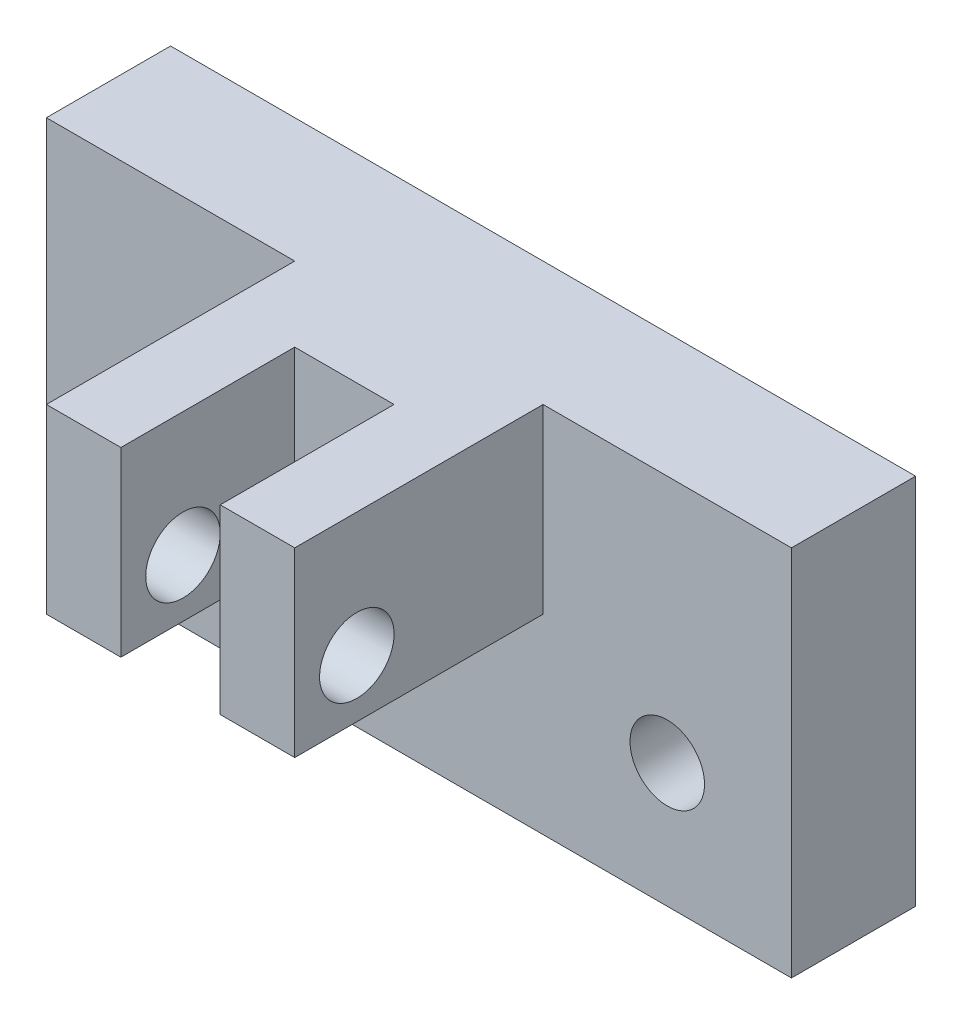
ISO-10303-21;
HEADER;
FILE_DESCRIPTION(('STEP AP214'),'2;1');
FILE_NAME('part.step','',(''),(''),'','','');
FILE_SCHEMA(('AUTOMOTIVE_DESIGN { 1 0 10303 214 1 1 1 1 }'));
ENDSEC;
DATA;
#1=APPLICATION_CONTEXT('core data for automotive mechanical design processes');
#2=APPLICATION_PROTOCOL_DEFINITION('international standard','automotive_design',2000,#1);
#3=PRODUCT_CONTEXT('',#1,'mechanical');
#4=PRODUCT('Part','Part','',(#3));
#5=PRODUCT_RELATED_PRODUCT_CATEGORY('part','',(#4));
#6=PRODUCT_DEFINITION_FORMATION('','',#4);
#7=PRODUCT_DEFINITION_CONTEXT('part definition',#1,'design');
#8=PRODUCT_DEFINITION('design','',#6,#7);
#9=PRODUCT_DEFINITION_SHAPE('','',#8);
#10=(LENGTH_UNIT() NAMED_UNIT(*) SI_UNIT(.MILLI.,.METRE.));
#11=(NAMED_UNIT(*) PLANE_ANGLE_UNIT() SI_UNIT($,.RADIAN.));
#12=(NAMED_UNIT(*) SI_UNIT($,.STERADIAN.) SOLID_ANGLE_UNIT());
#13=UNCERTAINTY_MEASURE_WITH_UNIT(LENGTH_MEASURE(1.E-05),#10,'distance_accuracy_value','');
#14=(GEOMETRIC_REPRESENTATION_CONTEXT(3) GLOBAL_UNCERTAINTY_ASSIGNED_CONTEXT((#13)) GLOBAL_UNIT_ASSIGNED_CONTEXT((#10,
#11,#12)) REPRESENTATION_CONTEXT('',''));
#15=CARTESIAN_POINT('',(0.,0.,0.));
#16=DIRECTION('',(0.,0.,1.));
#17=DIRECTION('',(1.,0.,0.));
#18=AXIS2_PLACEMENT_3D('',#15,#16,#17);
#19=CARTESIAN_POINT('',(0.,0.,15.));
#20=DIRECTION('',(0.,0.,1.));
#21=DIRECTION('',(1.,0.,0.));
#22=AXIS2_PLACEMENT_3D('',#19,#20,#21);
#23=PLANE('',#22);
#24=DIRECTION('',(0.,-1.,0.));
#25=VECTOR('',#24,1.);
#26=CARTESIAN_POINT('',(13.,15.,15.));
#27=LINE('',#26,#25);
#28=CARTESIAN_POINT('',(13.,15.,15.));
#29=VERTEX_POINT('',#28);
#30=CARTESIAN_POINT('',(13.,7.68582927556397,15.));
#31=VERTEX_POINT('',#30);
#32=EDGE_CURVE('E133',#29,#31,#27,.T.);
#33=ORIENTED_EDGE('',*,*,#32,.F.);
#34=DIRECTION('',(-1.,0.,0.));
#35=VECTOR('',#34,1.);
#36=CARTESIAN_POINT('',(10.,15.,15.));
#37=LINE('',#36,#35);
#38=CARTESIAN_POINT('',(10.,15.,15.));
#39=VERTEX_POINT('',#38);
#40=EDGE_CURVE('E182',#29,#39,#37,.T.);
#41=ORIENTED_EDGE('',*,*,#40,.T.);
#42=DIRECTION('',(0.,-1.,0.));
#43=VECTOR('',#42,1.);
#44=CARTESIAN_POINT('',(10.,15.,15.));
#45=LINE('',#44,#43);
#46=CARTESIAN_POINT('',(10.,7.68582927556397,15.));
#47=VERTEX_POINT('',#46);
#48=EDGE_CURVE('E173',#39,#47,#45,.T.);
#49=ORIENTED_EDGE('',*,*,#48,.T.);
#50=DIRECTION('',(1.,0.,0.));
#51=VECTOR('',#50,1.);
#52=CARTESIAN_POINT('',(10.,7.68582927556397,15.));
#53=LINE('',#52,#51);
#54=EDGE_CURVE('E178',#47,#31,#53,.T.);
#55=ORIENTED_EDGE('',*,*,#54,.T.);
#56=EDGE_LOOP('',(#33,#41,#49,#55));
#57=FACE_BOUND('',#56,.T.);
#58=ADVANCED_FACE('F37',(#57),#23,.T.);
#59=CARTESIAN_POINT('',(0.,0.,5.));
#60=DIRECTION('',(0.,0.,-1.));
#61=DIRECTION('',(-1.,0.,0.));
#62=AXIS2_PLACEMENT_3D('',#59,#60,#61);
#63=PLANE('',#62);
#64=CARTESIAN_POINT('',(25.,5.,5.));
#65=DIRECTION('',(0.,0.,1.));
#66=DIRECTION('',(1.,0.,0.));
#67=AXIS2_PLACEMENT_3D('',#64,#65,#66);
#68=CIRCLE('',#67,1.5);
#69=CARTESIAN_POINT('',(26.5,5.,5.));
#70=VERTEX_POINT('',#69);
#71=EDGE_CURVE('E161',#70,#70,#68,.T.);
#72=ORIENTED_EDGE('',*,*,#71,.F.);
#73=EDGE_LOOP('',(#72));
#74=FACE_BOUND('',#73,.T.);
#75=CARTESIAN_POINT('',(5.,5.,5.));
#76=DIRECTION('',(0.,0.,1.));
#77=DIRECTION('',(1.,0.,0.));
#78=AXIS2_PLACEMENT_3D('',#75,#76,#77);
#79=CIRCLE('',#78,1.5);
#80=CARTESIAN_POINT('',(6.5,5.,5.));
#81=VERTEX_POINT('',#80);
#82=EDGE_CURVE('E169',#81,#81,#79,.T.);
#83=ORIENTED_EDGE('',*,*,#82,.F.);
#84=EDGE_LOOP('',(#83));
#85=FACE_BOUND('',#84,.T.);
#86=DIRECTION('',(0.,-1.,0.));
#87=VECTOR('',#86,1.);
#88=CARTESIAN_POINT('',(10.,15.,5.));
#89=LINE('',#88,#87);
#90=CARTESIAN_POINT('',(10.,15.,5.));
#91=VERTEX_POINT('',#90);
#92=CARTESIAN_POINT('',(10.,7.68582927556397,5.));
#93=VERTEX_POINT('',#92);
#94=EDGE_CURVE('E187',#91,#93,#89,.T.);
#95=ORIENTED_EDGE('',*,*,#94,.F.);
#96=DIRECTION('',(-1.,0.,0.));
#97=VECTOR('',#96,1.);
#98=CARTESIAN_POINT('',(0.,15.,5.));
#99=LINE('',#98,#97);
#100=CARTESIAN_POINT('',(0.,15.,5.));
#101=VERTEX_POINT('',#100);
#102=EDGE_CURVE('E212',#91,#101,#99,.T.);
#103=ORIENTED_EDGE('',*,*,#102,.T.);
#104=DIRECTION('',(0.,-1.,0.));
#105=VECTOR('',#104,1.);
#106=CARTESIAN_POINT('',(0.,0.,5.));
#107=LINE('',#106,#105);
#108=CARTESIAN_POINT('',(0.,0.,5.));
#109=VERTEX_POINT('',#108);
#110=EDGE_CURVE('E204',#101,#109,#107,.T.);
#111=ORIENTED_EDGE('',*,*,#110,.T.);
#112=DIRECTION('',(1.,0.,0.));
#113=VECTOR('',#112,1.);
#114=CARTESIAN_POINT('',(0.,0.,5.));
#115=LINE('',#114,#113);
#116=CARTESIAN_POINT('',(30.,0.,5.));
#117=VERTEX_POINT('',#116);
#118=EDGE_CURVE('E207',#109,#117,#115,.T.);
#119=ORIENTED_EDGE('',*,*,#118,.T.);
#120=DIRECTION('',(0.,1.,0.));
#121=VECTOR('',#120,1.);
#122=CARTESIAN_POINT('',(30.,0.,5.));
#123=LINE('',#122,#121);
#124=CARTESIAN_POINT('',(30.,15.,5.));
#125=VERTEX_POINT('',#124);
#126=EDGE_CURVE('E210',#117,#125,#123,.T.);
#127=ORIENTED_EDGE('',*,*,#126,.T.);
#128=CARTESIAN_POINT('',(20.,15.,5.));
#129=VERTEX_POINT('',#128);
#130=EDGE_CURVE('E213',#125,#129,#99,.T.);
#131=ORIENTED_EDGE('',*,*,#130,.T.);
#132=DIRECTION('',(0.,1.,0.));
#133=VECTOR('',#132,1.);
#134=CARTESIAN_POINT('',(20.,15.,5.));
#135=LINE('',#134,#133);
#136=CARTESIAN_POINT('',(20.,7.68582927556397,5.));
#137=VERTEX_POINT('',#136);
#138=EDGE_CURVE('E177',#137,#129,#135,.T.);
#139=ORIENTED_EDGE('',*,*,#138,.F.);
#140=DIRECTION('',(1.,0.,0.));
#141=VECTOR('',#140,1.);
#142=CARTESIAN_POINT('',(10.,7.68582927556397,5.));
#143=LINE('',#142,#141);
#144=EDGE_CURVE('E62',#93,#137,#143,.T.);
#145=ORIENTED_EDGE('',*,*,#144,.F.);
#146=EDGE_LOOP('',(#95,#103,#111,#119,#127,#131,#139,#145));
#147=FACE_BOUND('',#146,.T.);
#148=ADVANCED_FACE('F264',(#74,#85,#147),#63,.F.);
#149=CARTESIAN_POINT('',(0.,0.,5.));
#150=DIRECTION('',(1.,0.,0.));
#151=DIRECTION('',(0.,0.,-1.));
#152=AXIS2_PLACEMENT_3D('',#149,#150,#151);
#153=PLANE('',#152);
#154=DIRECTION('',(0.,-1.,0.));
#155=VECTOR('',#154,1.);
#156=CARTESIAN_POINT('',(0.,0.,0.));
#157=LINE('',#156,#155);
#158=CARTESIAN_POINT('',(0.,15.,0.));
#159=VERTEX_POINT('',#158);
#160=CARTESIAN_POINT('',(0.,0.,0.));
#161=VERTEX_POINT('',#160);
#162=EDGE_CURVE('E203',#159,#161,#157,.T.);
#163=ORIENTED_EDGE('',*,*,#162,.T.);
#164=DIRECTION('',(0.,0.,-1.));
#165=VECTOR('',#164,1.);
#166=CARTESIAN_POINT('',(0.,0.,5.));
#167=LINE('',#166,#165);
#168=EDGE_CURVE('E11',#109,#161,#167,.T.);
#169=ORIENTED_EDGE('',*,*,#168,.F.);
#170=ORIENTED_EDGE('',*,*,#110,.F.);
#171=DIRECTION('',(0.,0.,-1.));
#172=VECTOR('',#171,1.);
#173=CARTESIAN_POINT('',(0.,15.,5.));
#174=LINE('',#173,#172);
#175=EDGE_CURVE('E215',#101,#159,#174,.T.);
#176=ORIENTED_EDGE('',*,*,#175,.T.);
#177=EDGE_LOOP('',(#163,#169,#170,#176));
#178=FACE_BOUND('',#177,.T.);
#179=ADVANCED_FACE('F39',(#178),#153,.F.);
#180=CARTESIAN_POINT('',(0.,0.,5.));
#181=DIRECTION('',(0.,1.,0.));
#182=DIRECTION('',(0.,0.,1.));
#183=AXIS2_PLACEMENT_3D('',#180,#181,#182);
#184=PLANE('',#183);
#185=DIRECTION('',(1.,0.,0.));
#186=VECTOR('',#185,1.);
#187=CARTESIAN_POINT('',(0.,0.,0.));
#188=LINE('',#187,#186);
#189=CARTESIAN_POINT('',(30.,0.,0.));
#190=VERTEX_POINT('',#189);
#191=EDGE_CURVE('E218',#161,#190,#188,.T.);
#192=ORIENTED_EDGE('',*,*,#191,.T.);
#193=DIRECTION('',(0.,0.,-1.));
#194=VECTOR('',#193,1.);
#195=CARTESIAN_POINT('',(30.,0.,5.));
#196=LINE('',#195,#194);
#197=EDGE_CURVE('E46',#117,#190,#196,.T.);
#198=ORIENTED_EDGE('',*,*,#197,.F.);
#199=ORIENTED_EDGE('',*,*,#118,.F.);
#200=ORIENTED_EDGE('',*,*,#168,.T.);
#201=EDGE_LOOP('',(#192,#198,#199,#200));
#202=FACE_BOUND('',#201,.T.);
#203=ADVANCED_FACE('F263',(#202),#184,.F.);
#204=CARTESIAN_POINT('',(30.,0.,5.));
#205=DIRECTION('',(-1.,0.,0.));
#206=DIRECTION('',(0.,0.,1.));
#207=AXIS2_PLACEMENT_3D('',#204,#205,#206);
#208=PLANE('',#207);
#209=DIRECTION('',(0.,1.,0.));
#210=VECTOR('',#209,1.);
#211=CARTESIAN_POINT('',(30.,0.,0.));
#212=LINE('',#211,#210);
#213=CARTESIAN_POINT('',(30.,15.,0.));
#214=VERTEX_POINT('',#213);
#215=EDGE_CURVE('E220',#190,#214,#212,.T.);
#216=ORIENTED_EDGE('',*,*,#215,.T.);
#217=DIRECTION('',(0.,0.,-1.));
#218=VECTOR('',#217,1.);
#219=CARTESIAN_POINT('',(30.,15.,5.));
#220=LINE('',#219,#218);
#221=EDGE_CURVE('E225',#125,#214,#220,.T.);
#222=ORIENTED_EDGE('',*,*,#221,.F.);
#223=ORIENTED_EDGE('',*,*,#126,.F.);
#224=ORIENTED_EDGE('',*,*,#197,.T.);
#225=EDGE_LOOP('',(#216,#222,#223,#224));
#226=FACE_BOUND('',#225,.T.);
#227=ADVANCED_FACE('F260',(#226),#208,.F.);
#228=CARTESIAN_POINT('',(0.,15.,5.));
#229=DIRECTION('',(0.,-1.,0.));
#230=DIRECTION('',(0.,0.,-1.));
#231=AXIS2_PLACEMENT_3D('',#228,#229,#230);
#232=PLANE('',#231);
#233=ORIENTED_EDGE('',*,*,#40,.F.);
#234=DIRECTION('',(0.,0.,1.));
#235=VECTOR('',#234,1.);
#236=CARTESIAN_POINT('',(13.,15.,8.));
#237=LINE('',#236,#235);
#238=CARTESIAN_POINT('',(13.,15.,8.));
#239=VERTEX_POINT('',#238);
#240=EDGE_CURVE('E159',#239,#29,#237,.T.);
#241=ORIENTED_EDGE('',*,*,#240,.F.);
#242=DIRECTION('',(-1.,0.,0.));
#243=VECTOR('',#242,1.);
#244=CARTESIAN_POINT('',(13.,15.,8.));
#245=LINE('',#244,#243);
#246=CARTESIAN_POINT('',(17.,15.,8.));
#247=VERTEX_POINT('',#246);
#248=EDGE_CURVE('E137',#247,#239,#245,.T.);
#249=ORIENTED_EDGE('',*,*,#248,.F.);
#250=DIRECTION('',(0.,0.,1.));
#251=VECTOR('',#250,1.);
#252=CARTESIAN_POINT('',(17.,15.,8.));
#253=LINE('',#252,#251);
#254=CARTESIAN_POINT('',(17.,15.,15.));
#255=VERTEX_POINT('',#254);
#256=EDGE_CURVE('E162',#247,#255,#253,.T.);
#257=ORIENTED_EDGE('',*,*,#256,.T.);
#258=CARTESIAN_POINT('',(20.,15.,15.));
#259=VERTEX_POINT('',#258);
#260=EDGE_CURVE('E183',#259,#255,#37,.T.);
#261=ORIENTED_EDGE('',*,*,#260,.F.);
#262=DIRECTION('',(0.,0.,-1.));
#263=VECTOR('',#262,1.);
#264=CARTESIAN_POINT('',(20.,15.,15.));
#265=LINE('',#264,#263);
#266=EDGE_CURVE('E195',#259,#129,#265,.T.);
#267=ORIENTED_EDGE('',*,*,#266,.T.);
#268=ORIENTED_EDGE('',*,*,#130,.F.);
#269=ORIENTED_EDGE('',*,*,#221,.T.);
#270=DIRECTION('',(-1.,0.,0.));
#271=VECTOR('',#270,1.);
#272=CARTESIAN_POINT('',(0.,15.,0.));
#273=LINE('',#272,#271);
#274=EDGE_CURVE('E208',#214,#159,#273,.T.);
#275=ORIENTED_EDGE('',*,*,#274,.T.);
#276=ORIENTED_EDGE('',*,*,#175,.F.);
#277=ORIENTED_EDGE('',*,*,#102,.F.);
#278=DIRECTION('',(0.,0.,-1.));
#279=VECTOR('',#278,1.);
#280=CARTESIAN_POINT('',(10.,15.,15.));
#281=LINE('',#280,#279);
#282=EDGE_CURVE('E186',#39,#91,#281,.T.);
#283=ORIENTED_EDGE('',*,*,#282,.F.);
#284=EDGE_LOOP('',(#233,#241,#249,#257,#261,#267,#268,#269,#275,#276,#277,#283));
#285=FACE_BOUND('',#284,.T.);
#286=ADVANCED_FACE('F241',(#285),#232,.F.);
#287=CARTESIAN_POINT('',(0.,0.,0.));
#288=DIRECTION('',(0.,0.,-1.));
#289=DIRECTION('',(-1.,0.,0.));
#290=AXIS2_PLACEMENT_3D('',#287,#288,#289);
#291=PLANE('',#290);
#292=CARTESIAN_POINT('',(25.,5.,0.));
#293=DIRECTION('',(0.,0.,-1.));
#294=DIRECTION('',(-1.,0.,0.));
#295=AXIS2_PLACEMENT_3D('',#292,#293,#294);
#296=CIRCLE('',#295,1.5);
#297=CARTESIAN_POINT('',(26.5,5.,0.));
#298=VERTEX_POINT('',#297);
#299=EDGE_CURVE('E168',#298,#298,#296,.T.);
#300=ORIENTED_EDGE('',*,*,#299,.F.);
#301=EDGE_LOOP('',(#300));
#302=FACE_BOUND('',#301,.T.);
#303=CARTESIAN_POINT('',(5.,5.,0.));
#304=DIRECTION('',(0.,0.,-1.));
#305=DIRECTION('',(-1.,0.,0.));
#306=AXIS2_PLACEMENT_3D('',#303,#304,#305);
#307=CIRCLE('',#306,1.5);
#308=CARTESIAN_POINT('',(6.5,5.,0.));
#309=VERTEX_POINT('',#308);
#310=EDGE_CURVE('E172',#309,#309,#307,.T.);
#311=ORIENTED_EDGE('',*,*,#310,.F.);
#312=EDGE_LOOP('',(#311));
#313=FACE_BOUND('',#312,.T.);
#314=ORIENTED_EDGE('',*,*,#162,.F.);
#315=ORIENTED_EDGE('',*,*,#274,.F.);
#316=ORIENTED_EDGE('',*,*,#215,.F.);
#317=ORIENTED_EDGE('',*,*,#191,.F.);
#318=EDGE_LOOP('',(#314,#315,#316,#317));
#319=FACE_BOUND('',#318,.T.);
#320=ADVANCED_FACE('F237',(#302,#313,#319),#291,.T.);
#321=CARTESIAN_POINT('',(10.,15.,15.));
#322=DIRECTION('',(1.,0.,0.));
#323=DIRECTION('',(0.,1.,0.));
#324=AXIS2_PLACEMENT_3D('',#321,#322,#323);
#325=PLANE('',#324);
#326=CARTESIAN_POINT('',(10.,10.,12.5));
#327=DIRECTION('',(-1.,0.,0.));
#328=DIRECTION('',(0.,-1.,0.));
#329=AXIS2_PLACEMENT_3D('',#326,#327,#328);
#330=CIRCLE('',#329,1.5);
#331=CARTESIAN_POINT('',(10.,8.5,12.5));
#332=VERTEX_POINT('',#331);
#333=EDGE_CURVE('E415',#332,#332,#330,.T.);
#334=ORIENTED_EDGE('',*,*,#333,.F.);
#335=EDGE_LOOP('',(#334));
#336=FACE_BOUND('',#335,.T.);
#337=ORIENTED_EDGE('',*,*,#94,.T.);
#338=DIRECTION('',(0.,0.,-1.));
#339=VECTOR('',#338,1.);
#340=CARTESIAN_POINT('',(10.,7.68582927556397,15.));
#341=LINE('',#340,#339);
#342=EDGE_CURVE('E201',#47,#93,#341,.T.);
#343=ORIENTED_EDGE('',*,*,#342,.F.);
#344=ORIENTED_EDGE('',*,*,#48,.F.);
#345=ORIENTED_EDGE('',*,*,#282,.T.);
#346=EDGE_LOOP('',(#337,#343,#344,#345));
#347=FACE_BOUND('',#346,.T.);
#348=ADVANCED_FACE('F240',(#336,#347),#325,.F.);
#349=CARTESIAN_POINT('',(10.,7.68582927556397,15.));
#350=DIRECTION('',(0.,1.,0.));
#351=DIRECTION('',(0.,0.,1.));
#352=AXIS2_PLACEMENT_3D('',#349,#350,#351);
#353=PLANE('',#352);
#354=DIRECTION('',(1.,0.,0.));
#355=VECTOR('',#354,1.);
#356=CARTESIAN_POINT('',(13.,7.68582927556397,8.));
#357=LINE('',#356,#355);
#358=CARTESIAN_POINT('',(13.,7.68582927556397,8.));
#359=VERTEX_POINT('',#358);
#360=CARTESIAN_POINT('',(17.,7.68582927556397,8.));
#361=VERTEX_POINT('',#360);
#362=EDGE_CURVE('E143',#359,#361,#357,.T.);
#363=ORIENTED_EDGE('',*,*,#362,.F.);
#364=DIRECTION('',(0.,0.,1.));
#365=VECTOR('',#364,1.);
#366=CARTESIAN_POINT('',(13.,7.68582927556397,8.));
#367=LINE('',#366,#365);
#368=EDGE_CURVE('E127',#359,#31,#367,.T.);
#369=ORIENTED_EDGE('',*,*,#368,.T.);
#370=ORIENTED_EDGE('',*,*,#54,.F.);
#371=ORIENTED_EDGE('',*,*,#342,.T.);
#372=ORIENTED_EDGE('',*,*,#144,.T.);
#373=DIRECTION('',(0.,0.,-1.));
#374=VECTOR('',#373,1.);
#375=CARTESIAN_POINT('',(20.,7.68582927556397,15.));
#376=LINE('',#375,#374);
#377=CARTESIAN_POINT('',(20.,7.68582927556397,15.));
#378=VERTEX_POINT('',#377);
#379=EDGE_CURVE('E198',#378,#137,#376,.T.);
#380=ORIENTED_EDGE('',*,*,#379,.F.);
#381=CARTESIAN_POINT('',(17.,7.68582927556397,15.));
#382=VERTEX_POINT('',#381);
#383=EDGE_CURVE('E176',#382,#378,#53,.T.);
#384=ORIENTED_EDGE('',*,*,#383,.F.);
#385=DIRECTION('',(0.,0.,1.));
#386=VECTOR('',#385,1.);
#387=CARTESIAN_POINT('',(17.,7.68582927556397,8.));
#388=LINE('',#387,#386);
#389=EDGE_CURVE('E54',#361,#382,#388,.T.);
#390=ORIENTED_EDGE('',*,*,#389,.F.);
#391=EDGE_LOOP('',(#363,#369,#370,#371,#372,#380,#384,#390));
#392=FACE_BOUND('',#391,.T.);
#393=ADVANCED_FACE('F148',(#392),#353,.F.);
#394=CARTESIAN_POINT('',(20.,15.,15.));
#395=DIRECTION('',(-1.,0.,0.));
#396=DIRECTION('',(0.,0.,1.));
#397=AXIS2_PLACEMENT_3D('',#394,#395,#396);
#398=PLANE('',#397);
#399=CARTESIAN_POINT('',(20.,10.,12.5));
#400=DIRECTION('',(-1.,0.,0.));
#401=DIRECTION('',(0.,0.,1.));
#402=AXIS2_PLACEMENT_3D('',#399,#400,#401);
#403=CIRCLE('',#402,1.5);
#404=CARTESIAN_POINT('',(20.,8.5,12.5));
#405=VERTEX_POINT('',#404);
#406=EDGE_CURVE('E157',#405,#405,#403,.T.);
#407=ORIENTED_EDGE('',*,*,#406,.T.);
#408=EDGE_LOOP('',(#407));
#409=FACE_BOUND('',#408,.T.);
#410=ORIENTED_EDGE('',*,*,#138,.T.);
#411=ORIENTED_EDGE('',*,*,#266,.F.);
#412=DIRECTION('',(0.,1.,0.));
#413=VECTOR('',#412,1.);
#414=CARTESIAN_POINT('',(20.,15.,15.));
#415=LINE('',#414,#413);
#416=EDGE_CURVE('E180',#378,#259,#415,.T.);
#417=ORIENTED_EDGE('',*,*,#416,.F.);
#418=ORIENTED_EDGE('',*,*,#379,.T.);
#419=EDGE_LOOP('',(#410,#411,#417,#418));
#420=FACE_BOUND('',#419,.T.);
#421=ADVANCED_FACE('F272',(#409,#420),#398,.F.);
#422=DIRECTION('',(0.,1.,0.));
#423=VECTOR('',#422,1.);
#424=CARTESIAN_POINT('',(17.,15.,15.));
#425=LINE('',#424,#423);
#426=EDGE_CURVE('E146',#382,#255,#425,.T.);
#427=ORIENTED_EDGE('',*,*,#426,.F.);
#428=ORIENTED_EDGE('',*,*,#383,.T.);
#429=ORIENTED_EDGE('',*,*,#416,.T.);
#430=ORIENTED_EDGE('',*,*,#260,.T.);
#431=EDGE_LOOP('',(#427,#428,#429,#430));
#432=FACE_BOUND('',#431,.T.);
#433=ADVANCED_FACE('F276',(#432),#23,.T.);
#434=CARTESIAN_POINT('',(5.,5.,-1.5));
#435=DIRECTION('',(0.,0.,1.));
#436=DIRECTION('',(1.,0.,0.));
#437=AXIS2_PLACEMENT_3D('',#434,#435,#436);
#438=CYLINDRICAL_SURFACE('',#437,1.5);
#439=CARTESIAN_POINT('',(6.5,5.,0.));
#440=CARTESIAN_POINT('',(6.5,5.,0.0520833333333336));
#441=CARTESIAN_POINT('',(6.5,5.,0.104166666666667));
#442=CARTESIAN_POINT('',(6.5,5.,0.208333333333334));
#443=CARTESIAN_POINT('',(6.5,5.,0.260416666666667));
#444=CARTESIAN_POINT('',(6.5,5.,0.364583333333334));
#445=CARTESIAN_POINT('',(6.5,5.,0.416666666666667));
#446=CARTESIAN_POINT('',(6.5,5.,0.520833333333333));
#447=CARTESIAN_POINT('',(6.5,5.,0.572916666666667));
#448=CARTESIAN_POINT('',(6.5,5.,0.677083333333333));
#449=CARTESIAN_POINT('',(6.5,5.,0.729166666666667));
#450=CARTESIAN_POINT('',(6.5,5.,0.833333333333334));
#451=CARTESIAN_POINT('',(6.5,5.,0.885416666666667));
#452=CARTESIAN_POINT('',(6.5,5.,0.989583333333334));
#453=CARTESIAN_POINT('',(6.5,5.,1.04166666666667));
#454=CARTESIAN_POINT('',(6.5,5.,1.14583333333333));
#455=CARTESIAN_POINT('',(6.5,5.,1.19791666666667));
#456=CARTESIAN_POINT('',(6.5,5.,1.30208333333333));
#457=CARTESIAN_POINT('',(6.5,5.,1.35416666666667));
#458=CARTESIAN_POINT('',(6.5,5.,1.45833333333333));
#459=CARTESIAN_POINT('',(6.5,5.,1.51041666666667));
#460=CARTESIAN_POINT('',(6.5,5.,1.61458333333333));
#461=CARTESIAN_POINT('',(6.5,5.,1.66666666666667));
#462=CARTESIAN_POINT('',(6.5,5.,1.77083333333333));
#463=CARTESIAN_POINT('',(6.5,5.,1.82291666666667));
#464=CARTESIAN_POINT('',(6.5,5.,1.92708333333333));
#465=CARTESIAN_POINT('',(6.5,5.,1.97916666666667));
#466=CARTESIAN_POINT('',(6.5,5.,2.08333333333333));
#467=CARTESIAN_POINT('',(6.5,5.,2.13541666666667));
#468=CARTESIAN_POINT('',(6.5,5.,2.23958333333333));
#469=CARTESIAN_POINT('',(6.5,5.,2.29166666666667));
#470=CARTESIAN_POINT('',(6.5,5.,2.39583333333333));
#471=CARTESIAN_POINT('',(6.5,5.,2.44791666666667));
#472=CARTESIAN_POINT('',(6.5,5.,2.55208333333333));
#473=CARTESIAN_POINT('',(6.5,5.,2.60416666666667));
#474=CARTESIAN_POINT('',(6.5,5.,2.70833333333333));
#475=CARTESIAN_POINT('',(6.5,5.,2.76041666666667));
#476=CARTESIAN_POINT('',(6.5,5.,2.86458333333333));
#477=CARTESIAN_POINT('',(6.5,5.,2.91666666666667));
#478=CARTESIAN_POINT('',(6.5,5.,3.02083333333333));
#479=CARTESIAN_POINT('',(6.5,5.,3.07291666666667));
#480=CARTESIAN_POINT('',(6.5,5.,3.17708333333333));
#481=CARTESIAN_POINT('',(6.5,5.,3.22916666666667));
#482=CARTESIAN_POINT('',(6.5,5.,3.33333333333333));
#483=CARTESIAN_POINT('',(6.5,5.,3.38541666666667));
#484=CARTESIAN_POINT('',(6.5,5.,3.48958333333333));
#485=CARTESIAN_POINT('',(6.5,5.,3.54166666666667));
#486=CARTESIAN_POINT('',(6.5,5.,3.64583333333333));
#487=CARTESIAN_POINT('',(6.5,5.,3.69791666666667));
#488=CARTESIAN_POINT('',(6.5,5.,3.80208333333333));
#489=CARTESIAN_POINT('',(6.5,5.,3.85416666666667));
#490=CARTESIAN_POINT('',(6.5,5.,3.95833333333333));
#491=CARTESIAN_POINT('',(6.5,5.,4.01041666666667));
#492=CARTESIAN_POINT('',(6.5,5.,4.11458333333333));
#493=CARTESIAN_POINT('',(6.5,5.,4.16666666666667));
#494=CARTESIAN_POINT('',(6.5,5.,4.27083333333333));
#495=CARTESIAN_POINT('',(6.5,5.,4.32291666666667));
#496=CARTESIAN_POINT('',(6.5,5.,4.42708333333333));
#497=CARTESIAN_POINT('',(6.5,5.,4.47916666666667));
#498=CARTESIAN_POINT('',(6.5,5.,4.58333333333333));
#499=CARTESIAN_POINT('',(6.5,5.,4.63541666666667));
#500=CARTESIAN_POINT('',(6.5,5.,4.73958333333333));
#501=CARTESIAN_POINT('',(6.5,5.,4.79166666666667));
#502=CARTESIAN_POINT('',(6.5,5.,4.89583333333333));
#503=CARTESIAN_POINT('',(6.5,5.,4.94791666666667));
#504=CARTESIAN_POINT('',(6.5,5.,5.));
#505=B_SPLINE_CURVE_WITH_KNOTS('',3,(#439,#440,#441,#442,#443,#444,#445,#446,#447,#448,#449,
#450,#451,#452,#453,#454,#455,#456,#457,#458,#459,#460,#461,#462,#463,#464,#465,#466,#467,#468,
#469,#470,#471,#472,#473,#474,#475,#476,#477,#478,#479,#480,#481,#482,#483,#484,#485,#486,#487,
#488,#489,#490,#491,#492,#493,#494,#495,#496,#497,#498,#499,#500,#501,#502,#503,#504),
.UNSPECIFIED.,.F.,.F.,(4,2,2,2,2,2,2,2,2,2,2,2,2,2,2,2,2,2,2,2,2,2,2,2,2,2,2,2,2,2,2,2,4),(0.,
0.15625,0.3125,0.46875,0.625,0.78125,0.9375,1.09375,1.25,1.40625,1.5625,1.71875,1.875,2.03125,
2.1875,2.34375,2.5,2.65625,2.8125,2.96875,3.125,3.28125,3.4375,3.59375,3.75,3.90625,4.0625,
4.21875,4.375,4.53125,4.6875,4.84375,5.),.UNSPECIFIED.);
#506=EDGE_CURVE('BSEAM301',#309,#81,#505,.T.);
#507=ORIENTED_EDGE('',*,*,#310,.T.);
#508=ORIENTED_EDGE('',*,*,#82,.T.);
#509=ORIENTED_EDGE('',*,*,#506,.T.);
#510=ORIENTED_EDGE('',*,*,#506,.F.);
#511=EDGE_LOOP('',(#507,#509,#508,#510));
#512=FACE_BOUND('',#511,.T.);
#513=ADVANCED_FACE('F301',(#512),#438,.F.);
#514=CARTESIAN_POINT('',(25.,5.,-1.5));
#515=DIRECTION('',(0.,0.,1.));
#516=DIRECTION('',(1.,0.,0.));
#517=AXIS2_PLACEMENT_3D('',#514,#515,#516);
#518=CYLINDRICAL_SURFACE('',#517,1.5);
#519=CARTESIAN_POINT('',(26.5,5.,0.));
#520=CARTESIAN_POINT('',(26.5,5.,0.0520833333333336));
#521=CARTESIAN_POINT('',(26.5,5.,0.104166666666667));
#522=CARTESIAN_POINT('',(26.5,5.,0.208333333333334));
#523=CARTESIAN_POINT('',(26.5,5.,0.260416666666667));
#524=CARTESIAN_POINT('',(26.5,5.,0.364583333333334));
#525=CARTESIAN_POINT('',(26.5,5.,0.416666666666667));
#526=CARTESIAN_POINT('',(26.5,5.,0.520833333333333));
#527=CARTESIAN_POINT('',(26.5,5.,0.572916666666667));
#528=CARTESIAN_POINT('',(26.5,5.,0.677083333333333));
#529=CARTESIAN_POINT('',(26.5,5.,0.729166666666667));
#530=CARTESIAN_POINT('',(26.5,5.,0.833333333333334));
#531=CARTESIAN_POINT('',(26.5,5.,0.885416666666667));
#532=CARTESIAN_POINT('',(26.5,5.,0.989583333333334));
#533=CARTESIAN_POINT('',(26.5,5.,1.04166666666667));
#534=CARTESIAN_POINT('',(26.5,5.,1.14583333333333));
#535=CARTESIAN_POINT('',(26.5,5.,1.19791666666667));
#536=CARTESIAN_POINT('',(26.5,5.,1.30208333333333));
#537=CARTESIAN_POINT('',(26.5,5.,1.35416666666667));
#538=CARTESIAN_POINT('',(26.5,5.,1.45833333333333));
#539=CARTESIAN_POINT('',(26.5,5.,1.51041666666667));
#540=CARTESIAN_POINT('',(26.5,5.,1.61458333333333));
#541=CARTESIAN_POINT('',(26.5,5.,1.66666666666667));
#542=CARTESIAN_POINT('',(26.5,5.,1.77083333333333));
#543=CARTESIAN_POINT('',(26.5,5.,1.82291666666667));
#544=CARTESIAN_POINT('',(26.5,5.,1.92708333333333));
#545=CARTESIAN_POINT('',(26.5,5.,1.97916666666667));
#546=CARTESIAN_POINT('',(26.5,5.,2.08333333333333));
#547=CARTESIAN_POINT('',(26.5,5.,2.13541666666667));
#548=CARTESIAN_POINT('',(26.5,5.,2.23958333333333));
#549=CARTESIAN_POINT('',(26.5,5.,2.29166666666667));
#550=CARTESIAN_POINT('',(26.5,5.,2.39583333333333));
#551=CARTESIAN_POINT('',(26.5,5.,2.44791666666667));
#552=CARTESIAN_POINT('',(26.5,5.,2.55208333333333));
#553=CARTESIAN_POINT('',(26.5,5.,2.60416666666667));
#554=CARTESIAN_POINT('',(26.5,5.,2.70833333333333));
#555=CARTESIAN_POINT('',(26.5,5.,2.76041666666667));
#556=CARTESIAN_POINT('',(26.5,5.,2.86458333333333));
#557=CARTESIAN_POINT('',(26.5,5.,2.91666666666667));
#558=CARTESIAN_POINT('',(26.5,5.,3.02083333333333));
#559=CARTESIAN_POINT('',(26.5,5.,3.07291666666667));
#560=CARTESIAN_POINT('',(26.5,5.,3.17708333333333));
#561=CARTESIAN_POINT('',(26.5,5.,3.22916666666667));
#562=CARTESIAN_POINT('',(26.5,5.,3.33333333333333));
#563=CARTESIAN_POINT('',(26.5,5.,3.38541666666667));
#564=CARTESIAN_POINT('',(26.5,5.,3.48958333333333));
#565=CARTESIAN_POINT('',(26.5,5.,3.54166666666667));
#566=CARTESIAN_POINT('',(26.5,5.,3.64583333333333));
#567=CARTESIAN_POINT('',(26.5,5.,3.69791666666667));
#568=CARTESIAN_POINT('',(26.5,5.,3.80208333333333));
#569=CARTESIAN_POINT('',(26.5,5.,3.85416666666667));
#570=CARTESIAN_POINT('',(26.5,5.,3.95833333333333));
#571=CARTESIAN_POINT('',(26.5,5.,4.01041666666667));
#572=CARTESIAN_POINT('',(26.5,5.,4.11458333333333));
#573=CARTESIAN_POINT('',(26.5,5.,4.16666666666667));
#574=CARTESIAN_POINT('',(26.5,5.,4.27083333333333));
#575=CARTESIAN_POINT('',(26.5,5.,4.32291666666667));
#576=CARTESIAN_POINT('',(26.5,5.,4.42708333333333));
#577=CARTESIAN_POINT('',(26.5,5.,4.47916666666667));
#578=CARTESIAN_POINT('',(26.5,5.,4.58333333333333));
#579=CARTESIAN_POINT('',(26.5,5.,4.63541666666667));
#580=CARTESIAN_POINT('',(26.5,5.,4.73958333333333));
#581=CARTESIAN_POINT('',(26.5,5.,4.79166666666667));
#582=CARTESIAN_POINT('',(26.5,5.,4.89583333333333));
#583=CARTESIAN_POINT('',(26.5,5.,4.94791666666667));
#584=CARTESIAN_POINT('',(26.5,5.,5.));
#585=B_SPLINE_CURVE_WITH_KNOTS('',3,(#519,#520,#521,#522,#523,#524,#525,#526,#527,#528,#529,
#530,#531,#532,#533,#534,#535,#536,#537,#538,#539,#540,#541,#542,#543,#544,#545,#546,#547,#548,
#549,#550,#551,#552,#553,#554,#555,#556,#557,#558,#559,#560,#561,#562,#563,#564,#565,#566,#567,
#568,#569,#570,#571,#572,#573,#574,#575,#576,#577,#578,#579,#580,#581,#582,#583,#584),
.UNSPECIFIED.,.F.,.F.,(4,2,2,2,2,2,2,2,2,2,2,2,2,2,2,2,2,2,2,2,2,2,2,2,2,2,2,2,2,2,2,2,4),(0.,
0.15625,0.3125,0.46875,0.625,0.78125,0.9375,1.09375,1.25,1.40625,1.5625,1.71875,1.875,2.03125,
2.1875,2.34375,2.5,2.65625,2.8125,2.96875,3.125,3.28125,3.4375,3.59375,3.75,3.90625,4.0625,
4.21875,4.375,4.53125,4.6875,4.84375,5.),.UNSPECIFIED.);
#586=EDGE_CURVE('BSEAM234',#298,#70,#585,.T.);
#587=ORIENTED_EDGE('',*,*,#299,.T.);
#588=ORIENTED_EDGE('',*,*,#71,.T.);
#589=ORIENTED_EDGE('',*,*,#586,.T.);
#590=ORIENTED_EDGE('',*,*,#586,.F.);
#591=EDGE_LOOP('',(#587,#589,#588,#590));
#592=FACE_BOUND('',#591,.T.);
#593=ADVANCED_FACE('F234',(#592),#518,.F.);
#594=CARTESIAN_POINT('',(13.,15.,8.));
#595=DIRECTION('',(-1.,0.,0.));
#596=DIRECTION('',(0.,-1.,0.));
#597=AXIS2_PLACEMENT_3D('',#594,#595,#596);
#598=PLANE('',#597);
#599=CARTESIAN_POINT('',(13.,10.,12.5));
#600=DIRECTION('',(-1.,0.,0.));
#601=DIRECTION('',(0.,-1.,0.));
#602=AXIS2_PLACEMENT_3D('',#599,#600,#601);
#603=CIRCLE('',#602,1.5);
#604=CARTESIAN_POINT('',(13.,8.5,12.5));
#605=VERTEX_POINT('',#604);
#606=EDGE_CURVE('E418',#605,#605,#603,.T.);
#607=ORIENTED_EDGE('',*,*,#606,.T.);
#608=EDGE_LOOP('',(#607));
#609=FACE_BOUND('',#608,.T.);
#610=ORIENTED_EDGE('',*,*,#32,.T.);
#611=ORIENTED_EDGE('',*,*,#368,.F.);
#612=DIRECTION('',(0.,-1.,0.));
#613=VECTOR('',#612,1.);
#614=CARTESIAN_POINT('',(13.,15.,8.));
#615=LINE('',#614,#613);
#616=EDGE_CURVE('E130',#239,#359,#615,.T.);
#617=ORIENTED_EDGE('',*,*,#616,.F.);
#618=ORIENTED_EDGE('',*,*,#240,.T.);
#619=EDGE_LOOP('',(#610,#611,#617,#618));
#620=FACE_BOUND('',#619,.T.);
#621=ADVANCED_FACE('F129',(#609,#620),#598,.F.);
#622=CARTESIAN_POINT('',(17.,15.,8.));
#623=DIRECTION('',(1.,0.,0.));
#624=DIRECTION('',(0.,0.,-1.));
#625=AXIS2_PLACEMENT_3D('',#622,#623,#624);
#626=PLANE('',#625);
#627=CARTESIAN_POINT('',(17.,10.,12.5));
#628=DIRECTION('',(1.,0.,0.));
#629=DIRECTION('',(0.,0.,-1.));
#630=AXIS2_PLACEMENT_3D('',#627,#628,#629);
#631=CIRCLE('',#630,1.5);
#632=CARTESIAN_POINT('',(17.,8.5,12.5));
#633=VERTEX_POINT('',#632);
#634=EDGE_CURVE('E41',#633,#633,#631,.T.);
#635=ORIENTED_EDGE('',*,*,#634,.T.);
#636=EDGE_LOOP('',(#635));
#637=FACE_BOUND('',#636,.T.);
#638=ORIENTED_EDGE('',*,*,#426,.T.);
#639=ORIENTED_EDGE('',*,*,#256,.F.);
#640=DIRECTION('',(0.,1.,0.));
#641=VECTOR('',#640,1.);
#642=CARTESIAN_POINT('',(17.,15.,8.));
#643=LINE('',#642,#641);
#644=EDGE_CURVE('E150',#361,#247,#643,.T.);
#645=ORIENTED_EDGE('',*,*,#644,.F.);
#646=ORIENTED_EDGE('',*,*,#389,.T.);
#647=EDGE_LOOP('',(#638,#639,#645,#646));
#648=FACE_BOUND('',#647,.T.);
#649=ADVANCED_FACE('F277',(#637,#648),#626,.F.);
#650=CARTESIAN_POINT('',(0.,0.,8.));
#651=DIRECTION('',(0.,0.,1.));
#652=DIRECTION('',(1.,0.,0.));
#653=AXIS2_PLACEMENT_3D('',#650,#651,#652);
#654=PLANE('',#653);
#655=ORIENTED_EDGE('',*,*,#616,.T.);
#656=ORIENTED_EDGE('',*,*,#362,.T.);
#657=ORIENTED_EDGE('',*,*,#644,.T.);
#658=ORIENTED_EDGE('',*,*,#248,.T.);
#659=EDGE_LOOP('',(#655,#656,#657,#658));
#660=FACE_BOUND('',#659,.T.);
#661=ADVANCED_FACE('F141',(#660),#654,.T.);
#662=CARTESIAN_POINT('',(25.,10.,12.5));
#663=DIRECTION('',(-1.,0.,0.));
#664=DIRECTION('',(0.,-1.,0.));
#665=AXIS2_PLACEMENT_3D('',#662,#663,#664);
#666=CYLINDRICAL_SURFACE('',#665,1.5);
#667=CARTESIAN_POINT('',(17.,8.5,12.5));
#668=CARTESIAN_POINT('',(17.03125,8.5,12.5));
#669=CARTESIAN_POINT('',(17.0625,8.5,12.5));
#670=CARTESIAN_POINT('',(17.125,8.5,12.5));
#671=CARTESIAN_POINT('',(17.15625,8.5,12.5));
#672=CARTESIAN_POINT('',(17.21875,8.5,12.5));
#673=CARTESIAN_POINT('',(17.25,8.5,12.5));
#674=CARTESIAN_POINT('',(17.3125,8.5,12.5));
#675=CARTESIAN_POINT('',(17.34375,8.5,12.5));
#676=CARTESIAN_POINT('',(17.40625,8.5,12.5));
#677=CARTESIAN_POINT('',(17.4375,8.5,12.5));
#678=CARTESIAN_POINT('',(17.5,8.5,12.5));
#679=CARTESIAN_POINT('',(17.53125,8.5,12.5));
#680=CARTESIAN_POINT('',(17.59375,8.5,12.5));
#681=CARTESIAN_POINT('',(17.625,8.5,12.5));
#682=CARTESIAN_POINT('',(17.6875,8.5,12.5));
#683=CARTESIAN_POINT('',(17.71875,8.5,12.5));
#684=CARTESIAN_POINT('',(17.78125,8.5,12.5));
#685=CARTESIAN_POINT('',(17.8125,8.5,12.5));
#686=CARTESIAN_POINT('',(17.875,8.5,12.5));
#687=CARTESIAN_POINT('',(17.90625,8.5,12.5));
#688=CARTESIAN_POINT('',(17.96875,8.5,12.5));
#689=CARTESIAN_POINT('',(18.,8.5,12.5));
#690=CARTESIAN_POINT('',(18.0625,8.5,12.5));
#691=CARTESIAN_POINT('',(18.09375,8.5,12.5));
#692=CARTESIAN_POINT('',(18.15625,8.5,12.5));
#693=CARTESIAN_POINT('',(18.1875,8.5,12.5));
#694=CARTESIAN_POINT('',(18.25,8.5,12.5));
#695=CARTESIAN_POINT('',(18.28125,8.5,12.5));
#696=CARTESIAN_POINT('',(18.34375,8.5,12.5));
#697=CARTESIAN_POINT('',(18.375,8.5,12.5));
#698=CARTESIAN_POINT('',(18.4375,8.5,12.5));
#699=CARTESIAN_POINT('',(18.46875,8.5,12.5));
#700=CARTESIAN_POINT('',(18.53125,8.5,12.5));
#701=CARTESIAN_POINT('',(18.5625,8.5,12.5));
#702=CARTESIAN_POINT('',(18.625,8.5,12.5));
#703=CARTESIAN_POINT('',(18.65625,8.5,12.5));
#704=CARTESIAN_POINT('',(18.71875,8.5,12.5));
#705=CARTESIAN_POINT('',(18.75,8.5,12.5));
#706=CARTESIAN_POINT('',(18.8125,8.5,12.5));
#707=CARTESIAN_POINT('',(18.84375,8.5,12.5));
#708=CARTESIAN_POINT('',(18.90625,8.5,12.5));
#709=CARTESIAN_POINT('',(18.9375,8.5,12.5));
#710=CARTESIAN_POINT('',(19.,8.5,12.5));
#711=CARTESIAN_POINT('',(19.03125,8.5,12.5));
#712=CARTESIAN_POINT('',(19.09375,8.5,12.5));
#713=CARTESIAN_POINT('',(19.125,8.5,12.5));
#714=CARTESIAN_POINT('',(19.1875,8.5,12.5));
#715=CARTESIAN_POINT('',(19.21875,8.5,12.5));
#716=CARTESIAN_POINT('',(19.28125,8.5,12.5));
#717=CARTESIAN_POINT('',(19.3125,8.5,12.5));
#718=CARTESIAN_POINT('',(19.375,8.5,12.5));
#719=CARTESIAN_POINT('',(19.40625,8.5,12.5));
#720=CARTESIAN_POINT('',(19.46875,8.5,12.5));
#721=CARTESIAN_POINT('',(19.5,8.5,12.5));
#722=CARTESIAN_POINT('',(19.5625,8.5,12.5));
#723=CARTESIAN_POINT('',(19.59375,8.5,12.5));
#724=CARTESIAN_POINT('',(19.65625,8.5,12.5));
#725=CARTESIAN_POINT('',(19.6875,8.5,12.5));
#726=CARTESIAN_POINT('',(19.75,8.5,12.5));
#727=CARTESIAN_POINT('',(19.78125,8.5,12.5));
#728=CARTESIAN_POINT('',(19.84375,8.5,12.5));
#729=CARTESIAN_POINT('',(19.875,8.5,12.5));
#730=CARTESIAN_POINT('',(19.9375,8.5,12.5));
#731=CARTESIAN_POINT('',(19.96875,8.5,12.5));
#732=CARTESIAN_POINT('',(20.,8.5,12.5));
#733=B_SPLINE_CURVE_WITH_KNOTS('',3,(#667,#668,#669,#670,#671,#672,#673,#674,#675,#676,#677,
#678,#679,#680,#681,#682,#683,#684,#685,#686,#687,#688,#689,#690,#691,#692,#693,#694,#695,#696,
#697,#698,#699,#700,#701,#702,#703,#704,#705,#706,#707,#708,#709,#710,#711,#712,#713,#714,#715,
#716,#717,#718,#719,#720,#721,#722,#723,#724,#725,#726,#727,#728,#729,#730,#731,#732),
.UNSPECIFIED.,.F.,.F.,(4,2,2,2,2,2,2,2,2,2,2,2,2,2,2,2,2,2,2,2,2,2,2,2,2,2,2,2,2,2,2,2,4),(0.,
0.0937500000000036,0.1875,0.28125,0.375,0.46875,0.5625,0.656250000000001,0.750000000000001,
0.843750000000001,0.937500000000001,1.03125,1.125,1.21875,1.3125,1.40625,1.5,1.59375,1.6875,
1.78125000000001,1.875,1.96875000000001,2.06250000000001,2.15625000000001,2.25000000000001,
2.34375000000001,2.43750000000001,2.53125000000001,2.62500000000001,2.71875000000001,
2.81250000000001,2.90625000000001,3.00000000000001),.UNSPECIFIED.);
#734=EDGE_CURVE('BSEAM286',#633,#405,#733,.T.);
#735=ORIENTED_EDGE('',*,*,#634,.F.);
#736=ORIENTED_EDGE('',*,*,#406,.F.);
#737=ORIENTED_EDGE('',*,*,#734,.T.);
#738=ORIENTED_EDGE('',*,*,#734,.F.);
#739=EDGE_LOOP('',(#735,#737,#736,#738));
#740=FACE_BOUND('',#739,.T.);
#741=ADVANCED_FACE('F286',(#740),#666,.F.);
#742=CARTESIAN_POINT('',(10.,8.5,12.5));
#743=CARTESIAN_POINT('',(10.03125,8.5,12.5));
#744=CARTESIAN_POINT('',(10.0625,8.5,12.5));
#745=CARTESIAN_POINT('',(10.125,8.5,12.5));
#746=CARTESIAN_POINT('',(10.15625,8.5,12.5));
#747=CARTESIAN_POINT('',(10.21875,8.5,12.5));
#748=CARTESIAN_POINT('',(10.25,8.5,12.5));
#749=CARTESIAN_POINT('',(10.3125,8.5,12.5));
#750=CARTESIAN_POINT('',(10.34375,8.5,12.5));
#751=CARTESIAN_POINT('',(10.40625,8.5,12.5));
#752=CARTESIAN_POINT('',(10.4375,8.5,12.5));
#753=CARTESIAN_POINT('',(10.5,8.5,12.5));
#754=CARTESIAN_POINT('',(10.53125,8.5,12.5));
#755=CARTESIAN_POINT('',(10.59375,8.5,12.5));
#756=CARTESIAN_POINT('',(10.625,8.5,12.5));
#757=CARTESIAN_POINT('',(10.6875,8.5,12.5));
#758=CARTESIAN_POINT('',(10.71875,8.5,12.5));
#759=CARTESIAN_POINT('',(10.78125,8.5,12.5));
#760=CARTESIAN_POINT('',(10.8125,8.5,12.5));
#761=CARTESIAN_POINT('',(10.875,8.5,12.5));
#762=CARTESIAN_POINT('',(10.90625,8.5,12.5));
#763=CARTESIAN_POINT('',(10.96875,8.5,12.5));
#764=CARTESIAN_POINT('',(11.,8.5,12.5));
#765=CARTESIAN_POINT('',(11.0625,8.5,12.5));
#766=CARTESIAN_POINT('',(11.09375,8.5,12.5));
#767=CARTESIAN_POINT('',(11.15625,8.5,12.5));
#768=CARTESIAN_POINT('',(11.1875,8.5,12.5));
#769=CARTESIAN_POINT('',(11.25,8.5,12.5));
#770=CARTESIAN_POINT('',(11.28125,8.5,12.5));
#771=CARTESIAN_POINT('',(11.34375,8.5,12.5));
#772=CARTESIAN_POINT('',(11.375,8.5,12.5));
#773=CARTESIAN_POINT('',(11.4375,8.5,12.5));
#774=CARTESIAN_POINT('',(11.46875,8.5,12.5));
#775=CARTESIAN_POINT('',(11.53125,8.5,12.5));
#776=CARTESIAN_POINT('',(11.5625,8.5,12.5));
#777=CARTESIAN_POINT('',(11.625,8.5,12.5));
#778=CARTESIAN_POINT('',(11.65625,8.5,12.5));
#779=CARTESIAN_POINT('',(11.71875,8.5,12.5));
#780=CARTESIAN_POINT('',(11.75,8.5,12.5));
#781=CARTESIAN_POINT('',(11.8125,8.5,12.5));
#782=CARTESIAN_POINT('',(11.84375,8.5,12.5));
#783=CARTESIAN_POINT('',(11.90625,8.5,12.5));
#784=CARTESIAN_POINT('',(11.9375,8.5,12.5));
#785=CARTESIAN_POINT('',(12.,8.5,12.5));
#786=CARTESIAN_POINT('',(12.03125,8.5,12.5));
#787=CARTESIAN_POINT('',(12.09375,8.5,12.5));
#788=CARTESIAN_POINT('',(12.125,8.5,12.5));
#789=CARTESIAN_POINT('',(12.1875,8.5,12.5));
#790=CARTESIAN_POINT('',(12.21875,8.5,12.5));
#791=CARTESIAN_POINT('',(12.28125,8.5,12.5));
#792=CARTESIAN_POINT('',(12.3125,8.5,12.5));
#793=CARTESIAN_POINT('',(12.375,8.5,12.5));
#794=CARTESIAN_POINT('',(12.40625,8.5,12.5));
#795=CARTESIAN_POINT('',(12.46875,8.5,12.5));
#796=CARTESIAN_POINT('',(12.5,8.5,12.5));
#797=CARTESIAN_POINT('',(12.5625,8.5,12.5));
#798=CARTESIAN_POINT('',(12.59375,8.5,12.5));
#799=CARTESIAN_POINT('',(12.65625,8.5,12.5));
#800=CARTESIAN_POINT('',(12.6875,8.5,12.5));
#801=CARTESIAN_POINT('',(12.75,8.5,12.5));
#802=CARTESIAN_POINT('',(12.78125,8.5,12.5));
#803=CARTESIAN_POINT('',(12.84375,8.5,12.5));
#804=CARTESIAN_POINT('',(12.875,8.5,12.5));
#805=CARTESIAN_POINT('',(12.9375,8.5,12.5));
#806=CARTESIAN_POINT('',(12.96875,8.5,12.5));
#807=CARTESIAN_POINT('',(13.,8.5,12.5));
#808=B_SPLINE_CURVE_WITH_KNOTS('',3,(#742,#743,#744,#745,#746,#747,#748,#749,#750,#751,#752,
#753,#754,#755,#756,#757,#758,#759,#760,#761,#762,#763,#764,#765,#766,#767,#768,#769,#770,#771,
#772,#773,#774,#775,#776,#777,#778,#779,#780,#781,#782,#783,#784,#785,#786,#787,#788,#789,#790,
#791,#792,#793,#794,#795,#796,#797,#798,#799,#800,#801,#802,#803,#804,#805,#806,#807),
.UNSPECIFIED.,.F.,.F.,(4,2,2,2,2,2,2,2,2,2,2,2,2,2,2,2,2,2,2,2,2,2,2,2,2,2,2,2,2,2,2,2,4),(0.,
0.0937500000000001,0.1875,0.28125,0.375,0.46875,0.5625,0.656250000000001,0.750000000000001,
0.843749999999999,0.937499999999999,1.03125,1.125,1.21875,1.3125,1.40625,1.5,1.59375,1.6875,
1.78125,1.875,1.96875,2.0625,2.15625,2.25,2.34375,2.4375,2.53125,2.625,2.71875,2.8125,2.90625,
3.),.UNSPECIFIED.);
#809=EDGE_CURVE('BSEAM399',#332,#605,#808,.T.);
#810=ORIENTED_EDGE('',*,*,#333,.T.);
#811=ORIENTED_EDGE('',*,*,#606,.F.);
#812=ORIENTED_EDGE('',*,*,#809,.T.);
#813=ORIENTED_EDGE('',*,*,#809,.F.);
#814=EDGE_LOOP('',(#810,#812,#811,#813));
#815=FACE_BOUND('',#814,.T.);
#816=ADVANCED_FACE('F399',(#815),#666,.F.);
#817=CLOSED_SHELL('',(#58,#148,#179,#203,#227,#286,#320,#348,#393,#421,#433,#513,#593,#621,#649,
#661,#741,#816));
#818=MANIFOLD_SOLID_BREP('B2',#817);
#819=ADVANCED_BREP_SHAPE_REPRESENTATION('',(#18,#818),#14);
#820=SHAPE_DEFINITION_REPRESENTATION(#9,#819);
ENDSEC;
END-ISO-10303-21;
